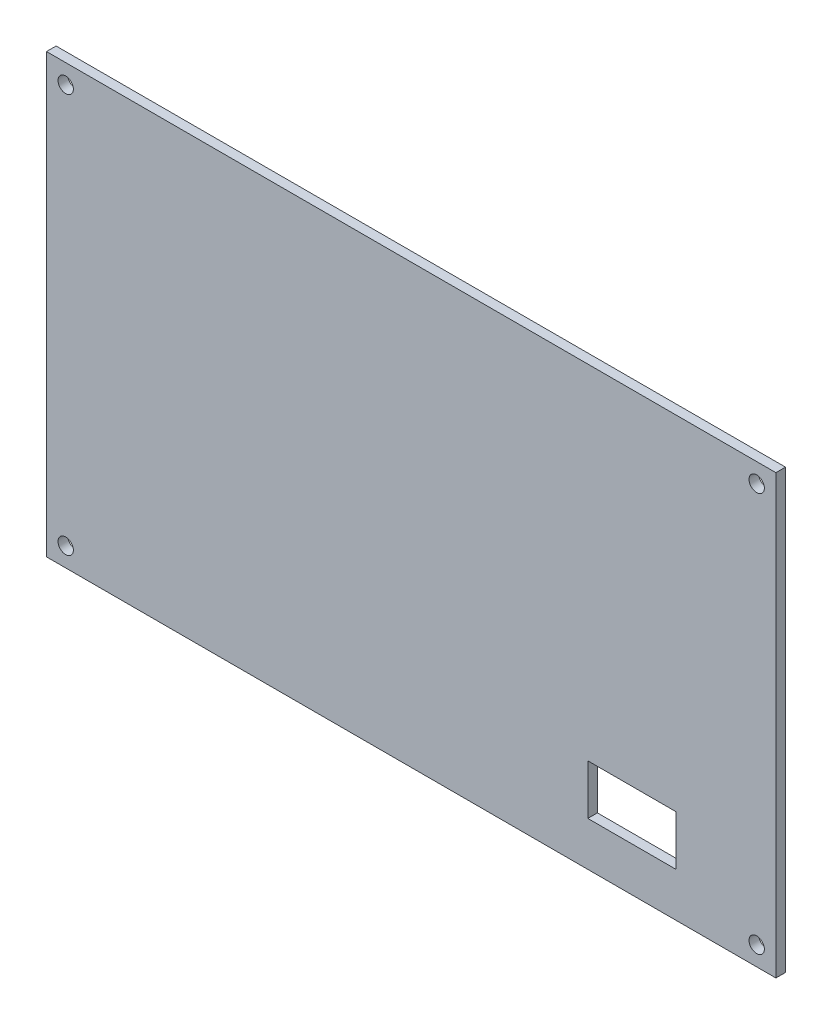
ISO-10303-21;
HEADER;
FILE_DESCRIPTION(('STEP AP214'),'2;1');
FILE_NAME('part.step','',(''),(''),'','','');
FILE_SCHEMA(('AUTOMOTIVE_DESIGN { 1 0 10303 214 1 1 1 1 }'));
ENDSEC;
DATA;
#1=APPLICATION_CONTEXT('core data for automotive mechanical design processes');
#2=APPLICATION_PROTOCOL_DEFINITION('international standard','automotive_design',2000,#1);
#3=PRODUCT_CONTEXT('',#1,'mechanical');
#4=PRODUCT('Part','Part','',(#3));
#5=PRODUCT_RELATED_PRODUCT_CATEGORY('part','',(#4));
#6=PRODUCT_DEFINITION_FORMATION('','',#4);
#7=PRODUCT_DEFINITION_CONTEXT('part definition',#1,'design');
#8=PRODUCT_DEFINITION('design','',#6,#7);
#9=PRODUCT_DEFINITION_SHAPE('','',#8);
#10=(LENGTH_UNIT() NAMED_UNIT(*) SI_UNIT(.MILLI.,.METRE.));
#11=(NAMED_UNIT(*) PLANE_ANGLE_UNIT() SI_UNIT($,.RADIAN.));
#12=(NAMED_UNIT(*) SI_UNIT($,.STERADIAN.) SOLID_ANGLE_UNIT());
#13=UNCERTAINTY_MEASURE_WITH_UNIT(LENGTH_MEASURE(1.E-05),#10,'distance_accuracy_value','');
#14=(GEOMETRIC_REPRESENTATION_CONTEXT(3) GLOBAL_UNCERTAINTY_ASSIGNED_CONTEXT((#13)) GLOBAL_UNIT_ASSIGNED_CONTEXT((#10,
#11,#12)) REPRESENTATION_CONTEXT('',''));
#15=CARTESIAN_POINT('',(0.,0.,0.));
#16=DIRECTION('',(0.,0.,1.));
#17=DIRECTION('',(1.,0.,0.));
#18=AXIS2_PLACEMENT_3D('',#15,#16,#17);
#19=CARTESIAN_POINT('',(95.,-57.,2.5));
#20=DIRECTION('',(-1.,0.,0.));
#21=DIRECTION('',(0.,0.,1.));
#22=AXIS2_PLACEMENT_3D('',#19,#20,#21);
#23=PLANE('',#22);
#24=DIRECTION('',(0.,1.,0.));
#25=VECTOR('',#24,1.);
#26=CARTESIAN_POINT('',(95.,-57.,0.));
#27=LINE('',#26,#25);
#28=CARTESIAN_POINT('',(95.,-57.,0.));
#29=VERTEX_POINT('',#28);
#30=CARTESIAN_POINT('',(95.,57.,0.));
#31=VERTEX_POINT('',#30);
#32=EDGE_CURVE('E148',#29,#31,#27,.T.);
#33=ORIENTED_EDGE('',*,*,#32,.T.);
#34=DIRECTION('',(0.,0.,-1.));
#35=VECTOR('',#34,1.);
#36=CARTESIAN_POINT('',(95.,57.,2.5));
#37=LINE('',#36,#35);
#38=CARTESIAN_POINT('',(95.,57.,2.5));
#39=VERTEX_POINT('',#38);
#40=EDGE_CURVE('E165',#39,#31,#37,.T.);
#41=ORIENTED_EDGE('',*,*,#40,.F.);
#42=DIRECTION('',(0.,1.,0.));
#43=VECTOR('',#42,1.);
#44=CARTESIAN_POINT('',(95.,-57.,2.5));
#45=LINE('',#44,#43);
#46=CARTESIAN_POINT('',(95.,-57.,2.5));
#47=VERTEX_POINT('',#46);
#48=EDGE_CURVE('E137',#47,#39,#45,.T.);
#49=ORIENTED_EDGE('',*,*,#48,.F.);
#50=DIRECTION('',(0.,0.,-1.));
#51=VECTOR('',#50,1.);
#52=CARTESIAN_POINT('',(95.,-57.,2.5));
#53=LINE('',#52,#51);
#54=EDGE_CURVE('E147',#47,#29,#53,.T.);
#55=ORIENTED_EDGE('',*,*,#54,.T.);
#56=EDGE_LOOP('',(#33,#41,#49,#55));
#57=FACE_BOUND('',#56,.T.);
#58=ADVANCED_FACE('F33',(#57),#23,.F.);
#59=CARTESIAN_POINT('',(-95.,57.,2.5));
#60=DIRECTION('',(0.,-1.,0.));
#61=DIRECTION('',(0.,0.,-1.));
#62=AXIS2_PLACEMENT_3D('',#59,#60,#61);
#63=PLANE('',#62);
#64=DIRECTION('',(-1.,0.,0.));
#65=VECTOR('',#64,1.);
#66=CARTESIAN_POINT('',(-95.,57.,0.));
#67=LINE('',#66,#65);
#68=CARTESIAN_POINT('',(-95.,57.,0.));
#69=VERTEX_POINT('',#68);
#70=EDGE_CURVE('E151',#31,#69,#67,.T.);
#71=ORIENTED_EDGE('',*,*,#70,.T.);
#72=DIRECTION('',(0.,0.,-1.));
#73=VECTOR('',#72,1.);
#74=CARTESIAN_POINT('',(-95.,57.,2.5));
#75=LINE('',#74,#73);
#76=CARTESIAN_POINT('',(-95.,57.,2.5));
#77=VERTEX_POINT('',#76);
#78=EDGE_CURVE('E162',#77,#69,#75,.T.);
#79=ORIENTED_EDGE('',*,*,#78,.F.);
#80=DIRECTION('',(-1.,0.,0.));
#81=VECTOR('',#80,1.);
#82=CARTESIAN_POINT('',(-95.,57.,2.5));
#83=LINE('',#82,#81);
#84=EDGE_CURVE('E140',#39,#77,#83,.T.);
#85=ORIENTED_EDGE('',*,*,#84,.F.);
#86=ORIENTED_EDGE('',*,*,#40,.T.);
#87=EDGE_LOOP('',(#71,#79,#85,#86));
#88=FACE_BOUND('',#87,.T.);
#89=ADVANCED_FACE('F203',(#88),#63,.F.);
#90=CARTESIAN_POINT('',(-95.,-57.,2.5));
#91=DIRECTION('',(1.,0.,0.));
#92=DIRECTION('',(0.,0.,-1.));
#93=AXIS2_PLACEMENT_3D('',#90,#91,#92);
#94=PLANE('',#93);
#95=DIRECTION('',(0.,-1.,0.));
#96=VECTOR('',#95,1.);
#97=CARTESIAN_POINT('',(-95.,-57.,0.));
#98=LINE('',#97,#96);
#99=CARTESIAN_POINT('',(-95.,-57.,0.));
#100=VERTEX_POINT('',#99);
#101=EDGE_CURVE('E154',#69,#100,#98,.T.);
#102=ORIENTED_EDGE('',*,*,#101,.T.);
#103=DIRECTION('',(0.,0.,-1.));
#104=VECTOR('',#103,1.);
#105=CARTESIAN_POINT('',(-95.,-57.,2.5));
#106=LINE('',#105,#104);
#107=CARTESIAN_POINT('',(-95.,-57.,2.5));
#108=VERTEX_POINT('',#107);
#109=EDGE_CURVE('E159',#108,#100,#106,.T.);
#110=ORIENTED_EDGE('',*,*,#109,.F.);
#111=DIRECTION('',(0.,-1.,0.));
#112=VECTOR('',#111,1.);
#113=CARTESIAN_POINT('',(-95.,-57.,2.5));
#114=LINE('',#113,#112);
#115=EDGE_CURVE('E143',#77,#108,#114,.T.);
#116=ORIENTED_EDGE('',*,*,#115,.F.);
#117=ORIENTED_EDGE('',*,*,#78,.T.);
#118=EDGE_LOOP('',(#102,#110,#116,#117));
#119=FACE_BOUND('',#118,.T.);
#120=ADVANCED_FACE('F208',(#119),#94,.F.);
#121=CARTESIAN_POINT('',(-95.,-57.,2.5));
#122=DIRECTION('',(0.,1.,0.));
#123=DIRECTION('',(0.,0.,1.));
#124=AXIS2_PLACEMENT_3D('',#121,#122,#123);
#125=PLANE('',#124);
#126=DIRECTION('',(1.,0.,0.));
#127=VECTOR('',#126,1.);
#128=CARTESIAN_POINT('',(-95.,-57.,0.));
#129=LINE('',#128,#127);
#130=EDGE_CURVE('E141',#100,#29,#129,.T.);
#131=ORIENTED_EDGE('',*,*,#130,.T.);
#132=ORIENTED_EDGE('',*,*,#54,.F.);
#133=DIRECTION('',(1.,0.,0.));
#134=VECTOR('',#133,1.);
#135=CARTESIAN_POINT('',(-95.,-57.,2.5));
#136=LINE('',#135,#134);
#137=EDGE_CURVE('E145',#108,#47,#136,.T.);
#138=ORIENTED_EDGE('',*,*,#137,.F.);
#139=ORIENTED_EDGE('',*,*,#109,.T.);
#140=EDGE_LOOP('',(#131,#132,#138,#139));
#141=FACE_BOUND('',#140,.T.);
#142=ADVANCED_FACE('F223',(#141),#125,.F.);
#143=CARTESIAN_POINT('',(0.,0.,2.5));
#144=DIRECTION('',(0.,0.,-1.));
#145=DIRECTION('',(-1.,0.,0.));
#146=AXIS2_PLACEMENT_3D('',#143,#144,#145);
#147=PLANE('',#146);
#148=DIRECTION('',(-1.,0.,0.));
#149=VECTOR('',#148,1.);
#150=CARTESIAN_POINT('',(46.,-32.5,2.5));
#151=LINE('',#150,#149);
#152=CARTESIAN_POINT('',(69.,-32.5,2.5));
#153=VERTEX_POINT('',#152);
#154=CARTESIAN_POINT('',(46.,-32.5,2.5));
#155=VERTEX_POINT('',#154);
#156=EDGE_CURVE('E108',#153,#155,#151,.T.);
#157=ORIENTED_EDGE('',*,*,#156,.F.);
#158=DIRECTION('',(0.,1.,0.));
#159=VECTOR('',#158,1.);
#160=CARTESIAN_POINT('',(69.,-45.5,2.5));
#161=LINE('',#160,#159);
#162=CARTESIAN_POINT('',(69.,-45.5,2.5));
#163=VERTEX_POINT('',#162);
#164=EDGE_CURVE('E47',#163,#153,#161,.T.);
#165=ORIENTED_EDGE('',*,*,#164,.F.);
#166=DIRECTION('',(1.,0.,0.));
#167=VECTOR('',#166,1.);
#168=CARTESIAN_POINT('',(46.,-45.5,2.5));
#169=LINE('',#168,#167);
#170=CARTESIAN_POINT('',(46.,-45.5,2.5));
#171=VERTEX_POINT('',#170);
#172=EDGE_CURVE('E115',#171,#163,#169,.T.);
#173=ORIENTED_EDGE('',*,*,#172,.F.);
#174=DIRECTION('',(0.,-1.,0.));
#175=VECTOR('',#174,1.);
#176=CARTESIAN_POINT('',(46.,-45.5,2.5));
#177=LINE('',#176,#175);
#178=EDGE_CURVE('E99',#155,#171,#177,.T.);
#179=ORIENTED_EDGE('',*,*,#178,.F.);
#180=EDGE_LOOP('',(#157,#165,#173,#179));
#181=FACE_BOUND('',#180,.T.);
#182=CARTESIAN_POINT('',(-89.999999999999,-52.,2.5));
#183=DIRECTION('',(0.,0.,1.));
#184=DIRECTION('',(1.,0.,0.));
#185=AXIS2_PLACEMENT_3D('',#182,#183,#184);
#186=CIRCLE('',#185,2.);
#187=CARTESIAN_POINT('',(-87.9999999999989,-52.,2.5));
#188=VERTEX_POINT('',#187);
#189=EDGE_CURVE('E122',#188,#188,#186,.T.);
#190=ORIENTED_EDGE('',*,*,#189,.F.);
#191=EDGE_LOOP('',(#190));
#192=FACE_BOUND('',#191,.T.);
#193=CARTESIAN_POINT('',(90.,-52.,2.5));
#194=DIRECTION('',(0.,0.,1.));
#195=DIRECTION('',(1.,0.,0.));
#196=AXIS2_PLACEMENT_3D('',#193,#194,#195);
#197=CIRCLE('',#196,2.);
#198=CARTESIAN_POINT('',(92.,-52.,2.5));
#199=VERTEX_POINT('',#198);
#200=EDGE_CURVE('E129',#199,#199,#197,.T.);
#201=ORIENTED_EDGE('',*,*,#200,.F.);
#202=EDGE_LOOP('',(#201));
#203=FACE_BOUND('',#202,.T.);
#204=CARTESIAN_POINT('',(89.9999999999989,52.,2.5));
#205=DIRECTION('',(0.,0.,1.));
#206=DIRECTION('',(1.,0.,0.));
#207=AXIS2_PLACEMENT_3D('',#204,#205,#206);
#208=CIRCLE('',#207,2.);
#209=CARTESIAN_POINT('',(91.9999999999989,52.,2.5));
#210=VERTEX_POINT('',#209);
#211=EDGE_CURVE('E125',#210,#210,#208,.T.);
#212=ORIENTED_EDGE('',*,*,#211,.F.);
#213=EDGE_LOOP('',(#212));
#214=FACE_BOUND('',#213,.T.);
#215=CARTESIAN_POINT('',(-90.,52.,2.5));
#216=DIRECTION('',(0.,0.,1.));
#217=DIRECTION('',(1.,0.,0.));
#218=AXIS2_PLACEMENT_3D('',#215,#216,#217);
#219=CIRCLE('',#218,2.);
#220=CARTESIAN_POINT('',(-88.,52.,2.5));
#221=VERTEX_POINT('',#220);
#222=EDGE_CURVE('E128',#221,#221,#219,.T.);
#223=ORIENTED_EDGE('',*,*,#222,.F.);
#224=EDGE_LOOP('',(#223));
#225=FACE_BOUND('',#224,.T.);
#226=ORIENTED_EDGE('',*,*,#48,.T.);
#227=ORIENTED_EDGE('',*,*,#84,.T.);
#228=ORIENTED_EDGE('',*,*,#115,.T.);
#229=ORIENTED_EDGE('',*,*,#137,.T.);
#230=EDGE_LOOP('',(#226,#227,#228,#229));
#231=FACE_BOUND('',#230,.T.);
#232=ADVANCED_FACE('F112',(#181,#192,#203,#214,#225,#231),#147,.F.);
#233=CARTESIAN_POINT('',(0.,0.,0.));
#234=DIRECTION('',(0.,0.,-1.));
#235=DIRECTION('',(-1.,0.,0.));
#236=AXIS2_PLACEMENT_3D('',#233,#234,#235);
#237=PLANE('',#236);
#238=DIRECTION('',(0.,-1.,0.));
#239=VECTOR('',#238,1.);
#240=CARTESIAN_POINT('',(69.,0.,0.));
#241=LINE('',#240,#239);
#242=CARTESIAN_POINT('',(69.,-32.5,0.));
#243=VERTEX_POINT('',#242);
#244=CARTESIAN_POINT('',(69.,-45.5,0.));
#245=VERTEX_POINT('',#244);
#246=EDGE_CURVE('E11',#243,#245,#241,.T.);
#247=ORIENTED_EDGE('',*,*,#246,.F.);
#248=DIRECTION('',(1.,0.,0.));
#249=VECTOR('',#248,1.);
#250=CARTESIAN_POINT('',(0.,-32.5,0.));
#251=LINE('',#250,#249);
#252=CARTESIAN_POINT('',(46.,-32.5,0.));
#253=VERTEX_POINT('',#252);
#254=EDGE_CURVE('E168',#253,#243,#251,.T.);
#255=ORIENTED_EDGE('',*,*,#254,.F.);
#256=DIRECTION('',(0.,1.,0.));
#257=VECTOR('',#256,1.);
#258=CARTESIAN_POINT('',(46.,0.,0.));
#259=LINE('',#258,#257);
#260=CARTESIAN_POINT('',(46.,-45.5,0.));
#261=VERTEX_POINT('',#260);
#262=EDGE_CURVE('E102',#261,#253,#259,.T.);
#263=ORIENTED_EDGE('',*,*,#262,.F.);
#264=DIRECTION('',(-1.,0.,0.));
#265=VECTOR('',#264,1.);
#266=CARTESIAN_POINT('',(0.,-45.5,0.));
#267=LINE('',#266,#265);
#268=EDGE_CURVE('E40',#245,#261,#267,.T.);
#269=ORIENTED_EDGE('',*,*,#268,.F.);
#270=EDGE_LOOP('',(#247,#255,#263,#269));
#271=FACE_BOUND('',#270,.T.);
#272=CARTESIAN_POINT('',(-89.999999999999,-52.,0.));
#273=DIRECTION('',(0.,0.,-1.));
#274=DIRECTION('',(-1.,0.,0.));
#275=AXIS2_PLACEMENT_3D('',#272,#273,#274);
#276=CIRCLE('',#275,2.);
#277=CARTESIAN_POINT('',(-91.999999999999,-52.,0.));
#278=VERTEX_POINT('',#277);
#279=EDGE_CURVE('E152',#278,#278,#276,.T.);
#280=ORIENTED_EDGE('',*,*,#279,.F.);
#281=EDGE_LOOP('',(#280));
#282=FACE_BOUND('',#281,.T.);
#283=CARTESIAN_POINT('',(90.,-52.,0.));
#284=DIRECTION('',(0.,0.,-1.));
#285=DIRECTION('',(-1.,0.,0.));
#286=AXIS2_PLACEMENT_3D('',#283,#284,#285);
#287=CIRCLE('',#286,2.);
#288=CARTESIAN_POINT('',(88.,-52.,0.));
#289=VERTEX_POINT('',#288);
#290=EDGE_CURVE('E174',#289,#289,#287,.T.);
#291=ORIENTED_EDGE('',*,*,#290,.F.);
#292=EDGE_LOOP('',(#291));
#293=FACE_BOUND('',#292,.T.);
#294=CARTESIAN_POINT('',(89.9999999999989,52.,0.));
#295=DIRECTION('',(0.,0.,-1.));
#296=DIRECTION('',(-1.,0.,0.));
#297=AXIS2_PLACEMENT_3D('',#294,#295,#296);
#298=CIRCLE('',#297,2.);
#299=CARTESIAN_POINT('',(87.9999999999989,52.,0.));
#300=VERTEX_POINT('',#299);
#301=EDGE_CURVE('E171',#300,#300,#298,.T.);
#302=ORIENTED_EDGE('',*,*,#301,.F.);
#303=EDGE_LOOP('',(#302));
#304=FACE_BOUND('',#303,.T.);
#305=CARTESIAN_POINT('',(-90.,52.,0.));
#306=DIRECTION('',(0.,0.,-1.));
#307=DIRECTION('',(-1.,0.,0.));
#308=AXIS2_PLACEMENT_3D('',#305,#306,#307);
#309=CIRCLE('',#308,2.);
#310=CARTESIAN_POINT('',(-92.,52.,0.));
#311=VERTEX_POINT('',#310);
#312=EDGE_CURVE('E136',#311,#311,#309,.T.);
#313=ORIENTED_EDGE('',*,*,#312,.F.);
#314=EDGE_LOOP('',(#313));
#315=FACE_BOUND('',#314,.T.);
#316=ORIENTED_EDGE('',*,*,#32,.F.);
#317=ORIENTED_EDGE('',*,*,#130,.F.);
#318=ORIENTED_EDGE('',*,*,#101,.F.);
#319=ORIENTED_EDGE('',*,*,#70,.F.);
#320=EDGE_LOOP('',(#316,#317,#318,#319));
#321=FACE_BOUND('',#320,.T.);
#322=ADVANCED_FACE('F186',(#271,#282,#293,#304,#315,#321),#237,.T.);
#323=CARTESIAN_POINT('',(-90.,52.,-7.5));
#324=DIRECTION('',(0.,0.,1.));
#325=DIRECTION('',(1.,0.,0.));
#326=AXIS2_PLACEMENT_3D('',#323,#324,#325);
#327=CYLINDRICAL_SURFACE('',#326,2.);
#328=ORIENTED_EDGE('',*,*,#312,.T.);
#329=EDGE_LOOP('',(#328));
#330=FACE_BOUND('',#329,.T.);
#331=ORIENTED_EDGE('',*,*,#222,.T.);
#332=EDGE_LOOP('',(#331));
#333=FACE_BOUND('',#332,.T.);
#334=ADVANCED_FACE('F234',(#330,#333),#327,.F.);
#335=CARTESIAN_POINT('',(89.9999999999989,52.,-7.5));
#336=DIRECTION('',(0.,0.,1.));
#337=DIRECTION('',(1.,0.,0.));
#338=AXIS2_PLACEMENT_3D('',#335,#336,#337);
#339=CYLINDRICAL_SURFACE('',#338,2.);
#340=ORIENTED_EDGE('',*,*,#301,.T.);
#341=EDGE_LOOP('',(#340));
#342=FACE_BOUND('',#341,.T.);
#343=ORIENTED_EDGE('',*,*,#211,.T.);
#344=EDGE_LOOP('',(#343));
#345=FACE_BOUND('',#344,.T.);
#346=ADVANCED_FACE('F238',(#342,#345),#339,.F.);
#347=CARTESIAN_POINT('',(90.,-52.,-7.5));
#348=DIRECTION('',(0.,0.,1.));
#349=DIRECTION('',(1.,0.,0.));
#350=AXIS2_PLACEMENT_3D('',#347,#348,#349);
#351=CYLINDRICAL_SURFACE('',#350,2.);
#352=ORIENTED_EDGE('',*,*,#290,.T.);
#353=EDGE_LOOP('',(#352));
#354=FACE_BOUND('',#353,.T.);
#355=ORIENTED_EDGE('',*,*,#200,.T.);
#356=EDGE_LOOP('',(#355));
#357=FACE_BOUND('',#356,.T.);
#358=ADVANCED_FACE('F197',(#354,#357),#351,.F.);
#359=CARTESIAN_POINT('',(-89.999999999999,-52.,-7.5));
#360=DIRECTION('',(0.,0.,1.));
#361=DIRECTION('',(1.,0.,0.));
#362=AXIS2_PLACEMENT_3D('',#359,#360,#361);
#363=CYLINDRICAL_SURFACE('',#362,2.);
#364=ORIENTED_EDGE('',*,*,#279,.T.);
#365=EDGE_LOOP('',(#364));
#366=FACE_BOUND('',#365,.T.);
#367=ORIENTED_EDGE('',*,*,#189,.T.);
#368=EDGE_LOOP('',(#367));
#369=FACE_BOUND('',#368,.T.);
#370=ADVANCED_FACE('F190',(#366,#369),#363,.F.);
#371=CARTESIAN_POINT('',(69.,-45.5,-18.5));
#372=DIRECTION('',(1.,0.,0.));
#373=DIRECTION('',(0.,0.,-1.));
#374=AXIS2_PLACEMENT_3D('',#371,#372,#373);
#375=PLANE('',#374);
#376=ORIENTED_EDGE('',*,*,#246,.T.);
#377=DIRECTION('',(0.,0.,1.));
#378=VECTOR('',#377,1.);
#379=CARTESIAN_POINT('',(69.,-45.5,-18.5));
#380=LINE('',#379,#378);
#381=EDGE_CURVE('E120',#245,#163,#380,.T.);
#382=ORIENTED_EDGE('',*,*,#381,.T.);
#383=ORIENTED_EDGE('',*,*,#164,.T.);
#384=DIRECTION('',(0.,0.,1.));
#385=VECTOR('',#384,1.);
#386=CARTESIAN_POINT('',(69.,-32.5,-18.5));
#387=LINE('',#386,#385);
#388=EDGE_CURVE('E105',#243,#153,#387,.T.);
#389=ORIENTED_EDGE('',*,*,#388,.F.);
#390=EDGE_LOOP('',(#376,#382,#383,#389));
#391=FACE_BOUND('',#390,.T.);
#392=ADVANCED_FACE('F188',(#391),#375,.F.);
#393=CARTESIAN_POINT('',(46.,-45.5,-18.5));
#394=DIRECTION('',(0.,-1.,0.));
#395=DIRECTION('',(0.,0.,-1.));
#396=AXIS2_PLACEMENT_3D('',#393,#394,#395);
#397=PLANE('',#396);
#398=ORIENTED_EDGE('',*,*,#268,.T.);
#399=DIRECTION('',(0.,0.,1.));
#400=VECTOR('',#399,1.);
#401=CARTESIAN_POINT('',(46.,-45.5,-18.5));
#402=LINE('',#401,#400);
#403=EDGE_CURVE('E104',#261,#171,#402,.T.);
#404=ORIENTED_EDGE('',*,*,#403,.T.);
#405=ORIENTED_EDGE('',*,*,#172,.T.);
#406=ORIENTED_EDGE('',*,*,#381,.F.);
#407=EDGE_LOOP('',(#398,#404,#405,#406));
#408=FACE_BOUND('',#407,.T.);
#409=ADVANCED_FACE('F183',(#408),#397,.F.);
#410=CARTESIAN_POINT('',(46.,-45.5,-18.5));
#411=DIRECTION('',(-1.,0.,0.));
#412=DIRECTION('',(0.,0.,1.));
#413=AXIS2_PLACEMENT_3D('',#410,#411,#412);
#414=PLANE('',#413);
#415=ORIENTED_EDGE('',*,*,#262,.T.);
#416=DIRECTION('',(0.,0.,1.));
#417=VECTOR('',#416,1.);
#418=CARTESIAN_POINT('',(46.,-32.5,-18.5));
#419=LINE('',#418,#417);
#420=EDGE_CURVE('E55',#253,#155,#419,.T.);
#421=ORIENTED_EDGE('',*,*,#420,.T.);
#422=ORIENTED_EDGE('',*,*,#178,.T.);
#423=ORIENTED_EDGE('',*,*,#403,.F.);
#424=EDGE_LOOP('',(#415,#421,#422,#423));
#425=FACE_BOUND('',#424,.T.);
#426=ADVANCED_FACE('F96',(#425),#414,.F.);
#427=CARTESIAN_POINT('',(46.,-32.5,-18.5));
#428=DIRECTION('',(0.,1.,0.));
#429=DIRECTION('',(0.,0.,1.));
#430=AXIS2_PLACEMENT_3D('',#427,#428,#429);
#431=PLANE('',#430);
#432=ORIENTED_EDGE('',*,*,#254,.T.);
#433=ORIENTED_EDGE('',*,*,#388,.T.);
#434=ORIENTED_EDGE('',*,*,#156,.T.);
#435=ORIENTED_EDGE('',*,*,#420,.F.);
#436=EDGE_LOOP('',(#432,#433,#434,#435));
#437=FACE_BOUND('',#436,.T.);
#438=ADVANCED_FACE('F109',(#437),#431,.F.);
#439=CLOSED_SHELL('',(#58,#89,#120,#142,#232,#322,#334,#346,#358,#370,#392,#409,#426,#438));
#440=MANIFOLD_SOLID_BREP('B2',#439);
#441=ADVANCED_BREP_SHAPE_REPRESENTATION('',(#18,#440),#14);
#442=SHAPE_DEFINITION_REPRESENTATION(#9,#441);
ENDSEC;
END-ISO-10303-21;
